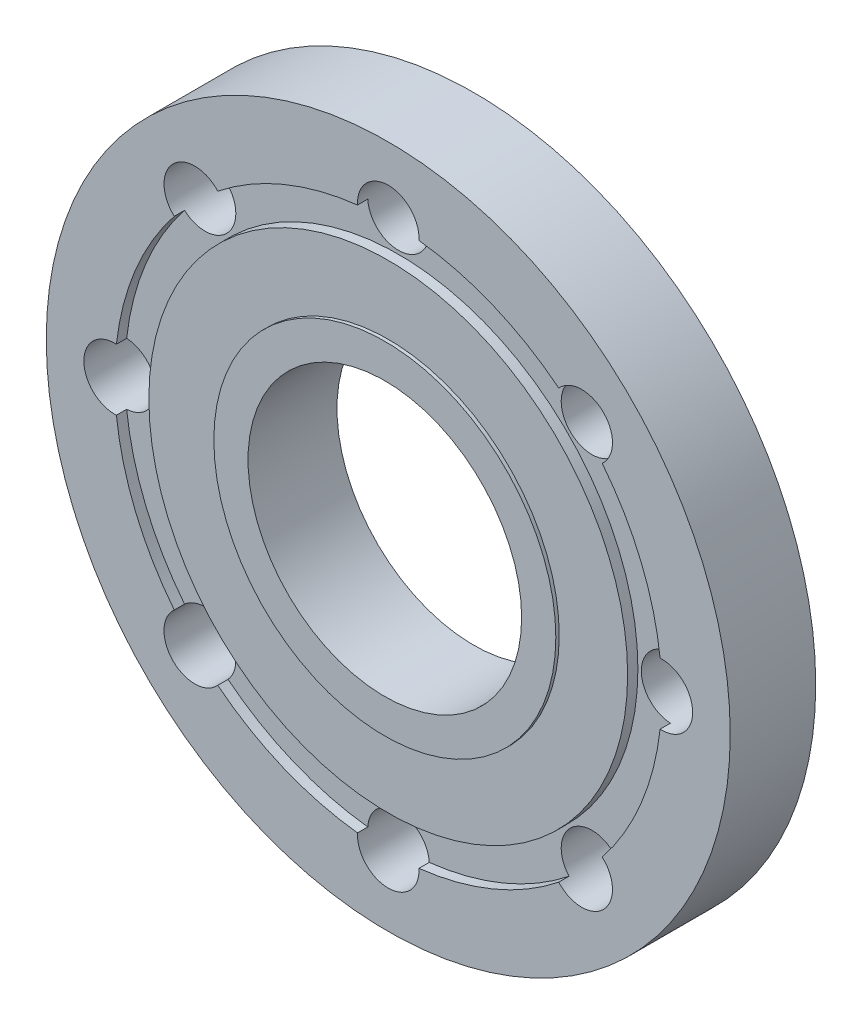
ISO-10303-21;
HEADER;
FILE_DESCRIPTION(('STEP AP214'),'2;1');
FILE_NAME('part.step','',(''),(''),'','','');
FILE_SCHEMA(('AUTOMOTIVE_DESIGN { 1 0 10303 214 1 1 1 1 }'));
ENDSEC;
DATA;
#1=APPLICATION_CONTEXT('core data for automotive mechanical design processes');
#2=APPLICATION_PROTOCOL_DEFINITION('international standard','automotive_design',2000,#1);
#3=PRODUCT_CONTEXT('',#1,'mechanical');
#4=PRODUCT('Part','Part','',(#3));
#5=PRODUCT_RELATED_PRODUCT_CATEGORY('part','',(#4));
#6=PRODUCT_DEFINITION_FORMATION('','',#4);
#7=PRODUCT_DEFINITION_CONTEXT('part definition',#1,'design');
#8=PRODUCT_DEFINITION('design','',#6,#7);
#9=PRODUCT_DEFINITION_SHAPE('','',#8);
#10=(LENGTH_UNIT() NAMED_UNIT(*) SI_UNIT(.MILLI.,.METRE.));
#11=(NAMED_UNIT(*) PLANE_ANGLE_UNIT() SI_UNIT($,.RADIAN.));
#12=(NAMED_UNIT(*) SI_UNIT($,.STERADIAN.) SOLID_ANGLE_UNIT());
#13=UNCERTAINTY_MEASURE_WITH_UNIT(LENGTH_MEASURE(1.E-05),#10,'distance_accuracy_value','');
#14=(GEOMETRIC_REPRESENTATION_CONTEXT(3) GLOBAL_UNCERTAINTY_ASSIGNED_CONTEXT((#13)) GLOBAL_UNIT_ASSIGNED_CONTEXT((#10,
#11,#12)) REPRESENTATION_CONTEXT('',''));
#15=CARTESIAN_POINT('',(0.,0.,0.));
#16=DIRECTION('',(0.,0.,1.));
#17=DIRECTION('',(1.,0.,0.));
#18=AXIS2_PLACEMENT_3D('',#15,#16,#17);
#19=CARTESIAN_POINT('',(0.,0.,25.));
#20=DIRECTION('',(0.,0.,1.));
#21=DIRECTION('',(1.,0.,0.));
#22=AXIS2_PLACEMENT_3D('',#19,#20,#21);
#23=PLANE('',#22);
#24=CARTESIAN_POINT('',(0.,0.,25.));
#25=DIRECTION('',(0.,0.,1.));
#26=DIRECTION('',(1.,0.,0.));
#27=AXIS2_PLACEMENT_3D('',#24,#25,#26);
#28=CIRCLE('',#27,50.);
#29=CARTESIAN_POINT('',(50.,0.,25.));
#30=VERTEX_POINT('',#29);
#31=EDGE_CURVE('E25',#30,#30,#28,.T.);
#32=ORIENTED_EDGE('',*,*,#31,.F.);
#33=EDGE_LOOP('',(#32));
#34=FACE_BOUND('',#33,.T.);
#35=CARTESIAN_POINT('',(3.794298208959E-13,0.,25.));
#36=DIRECTION('',(0.,0.,1.));
#37=DIRECTION('',(1.,0.,0.));
#38=AXIS2_PLACEMENT_3D('',#35,#36,#37);
#39=CIRCLE('',#38,70.);
#40=CARTESIAN_POINT('',(70.,0.,25.));
#41=VERTEX_POINT('',#40);
#42=EDGE_CURVE('E501',#41,#41,#39,.T.);
#43=ORIENTED_EDGE('',*,*,#42,.T.);
#44=EDGE_LOOP('',(#43));
#45=FACE_BOUND('',#44,.T.);
#46=ADVANCED_FACE('F16',(#34,#45),#23,.T.);
#47=CARTESIAN_POINT('',(0.,0.,25.));
#48=DIRECTION('',(0.,0.,1.));
#49=DIRECTION('',(1.,0.,0.));
#50=AXIS2_PLACEMENT_3D('',#47,#48,#49);
#51=CYLINDRICAL_SURFACE('',#50,50.);
#52=ORIENTED_EDGE('',*,*,#31,.T.);
#53=DIRECTION('',(0.,0.,1.));
#54=VECTOR('',#53,1.);
#55=CARTESIAN_POINT('',(50.,0.,25.));
#56=LINE('',#55,#54);
#57=CARTESIAN_POINT('',(50.,0.,26.));
#58=VERTEX_POINT('',#57);
#59=EDGE_CURVE('E10',#30,#58,#56,.T.);
#60=ORIENTED_EDGE('',*,*,#59,.T.);
#61=CARTESIAN_POINT('',(0.,0.,26.));
#62=DIRECTION('',(0.,0.,1.));
#63=DIRECTION('',(1.,0.,0.));
#64=AXIS2_PLACEMENT_3D('',#61,#62,#63);
#65=CIRCLE('',#64,50.);
#66=EDGE_CURVE('E505',#58,#58,#65,.T.);
#67=ORIENTED_EDGE('',*,*,#66,.F.);
#68=ORIENTED_EDGE('',*,*,#59,.F.);
#69=EDGE_LOOP('',(#52,#60,#67,#68));
#70=FACE_BOUND('',#69,.T.);
#71=ADVANCED_FACE('F526',(#70),#51,.T.);
#72=CARTESIAN_POINT('',(3.794298208959E-13,0.,26.));
#73=DIRECTION('',(0.,0.,1.));
#74=DIRECTION('',(1.,0.,0.));
#75=AXIS2_PLACEMENT_3D('',#72,#73,#74);
#76=CYLINDRICAL_SURFACE('',#75,70.);
#77=ORIENTED_EDGE('',*,*,#42,.F.);
#78=DIRECTION('',(0.,0.,-1.));
#79=VECTOR('',#78,1.);
#80=CARTESIAN_POINT('',(70.,0.,26.));
#81=LINE('',#80,#79);
#82=CARTESIAN_POINT('',(70.,0.,22.));
#83=VERTEX_POINT('',#82);
#84=EDGE_CURVE('E192',#41,#83,#81,.T.);
#85=ORIENTED_EDGE('',*,*,#84,.T.);
#86=CARTESIAN_POINT('',(3.794298208959E-13,0.,22.));
#87=DIRECTION('',(0.,0.,1.));
#88=DIRECTION('',(1.,0.,0.));
#89=AXIS2_PLACEMENT_3D('',#86,#87,#88);
#90=CIRCLE('',#89,70.);
#91=EDGE_CURVE('E373',#83,#83,#90,.T.);
#92=ORIENTED_EDGE('',*,*,#91,.T.);
#93=ORIENTED_EDGE('',*,*,#84,.F.);
#94=EDGE_LOOP('',(#77,#85,#92,#93));
#95=FACE_BOUND('',#94,.T.);
#96=ADVANCED_FACE('F530',(#95),#76,.T.);
#97=CARTESIAN_POINT('',(0.,0.,26.));
#98=DIRECTION('',(0.,0.,1.));
#99=DIRECTION('',(1.,0.,0.));
#100=AXIS2_PLACEMENT_3D('',#97,#98,#99);
#101=CYLINDRICAL_SURFACE('',#100,80.);
#102=DIRECTION('',(0.,0.,1.));
#103=VECTOR('',#102,1.);
#104=CARTESIAN_POINT('',(-49.85668461805,62.564454755845,26.));
#105=LINE('',#104,#103);
#106=CARTESIAN_POINT('',(-49.85668461805,62.564454755845,22.));
#107=VERTEX_POINT('',#106);
#108=CARTESIAN_POINT('',(-49.85668461805,62.564454755845,25.));
#109=VERTEX_POINT('',#108);
#110=EDGE_CURVE('E484',#107,#109,#105,.T.);
#111=ORIENTED_EDGE('',*,*,#110,.F.);
#112=CARTESIAN_POINT('',(0.,0.,22.));
#113=DIRECTION('',(0.,0.,1.));
#114=DIRECTION('',(1.,0.,0.));
#115=AXIS2_PLACEMENT_3D('',#112,#113,#114);
#116=CIRCLE('',#115,80.);
#117=CARTESIAN_POINT('',(-8.985750438194,79.49375,22.));
#118=VERTEX_POINT('',#117);
#119=EDGE_CURVE('E328',#118,#107,#116,.T.);
#120=ORIENTED_EDGE('',*,*,#119,.F.);
#121=DIRECTION('',(0.,0.,1.));
#122=VECTOR('',#121,1.);
#123=CARTESIAN_POINT('',(-8.985750438194,79.49375,26.));
#124=LINE('',#123,#122);
#125=CARTESIAN_POINT('',(-8.985750438194,79.49375,25.));
#126=VERTEX_POINT('',#125);
#127=EDGE_CURVE('E357',#118,#126,#124,.T.);
#128=ORIENTED_EDGE('',*,*,#127,.T.);
#129=CARTESIAN_POINT('',(0.,0.,25.));
#130=DIRECTION('',(0.,0.,1.));
#131=DIRECTION('',(1.,0.,0.));
#132=AXIS2_PLACEMENT_3D('',#129,#130,#131);
#133=CIRCLE('',#132,80.);
#134=EDGE_CURVE('E184',#126,#109,#133,.T.);
#135=ORIENTED_EDGE('',*,*,#134,.T.);
#136=EDGE_LOOP('',(#111,#120,#128,#135));
#137=FACE_BOUND('',#136,.T.);
#138=ADVANCED_FACE('F566',(#137),#101,.F.);
#139=CARTESIAN_POINT('',(0.,0.,26.));
#140=DIRECTION('',(0.,0.,1.));
#141=DIRECTION('',(1.,0.,0.));
#142=AXIS2_PLACEMENT_3D('',#139,#140,#141);
#143=CYLINDRICAL_SURFACE('',#142,80.);
#144=DIRECTION('',(0.,0.,1.));
#145=VECTOR('',#144,1.);
#146=CARTESIAN_POINT('',(-79.49375,8.985750438194,26.));
#147=LINE('',#146,#145);
#148=CARTESIAN_POINT('',(-79.49375,8.985750438194,22.));
#149=VERTEX_POINT('',#148);
#150=CARTESIAN_POINT('',(-79.49375,8.985750438194,25.));
#151=VERTEX_POINT('',#150);
#152=EDGE_CURVE('E452',#149,#151,#147,.T.);
#153=ORIENTED_EDGE('',*,*,#152,.F.);
#154=CARTESIAN_POINT('',(0.,0.,22.));
#155=DIRECTION('',(0.,0.,1.));
#156=DIRECTION('',(1.,0.,0.));
#157=AXIS2_PLACEMENT_3D('',#154,#155,#156);
#158=CIRCLE('',#157,80.);
#159=CARTESIAN_POINT('',(-62.56445475584,49.856684618051,22.));
#160=VERTEX_POINT('',#159);
#161=EDGE_CURVE('E324',#160,#149,#158,.T.);
#162=ORIENTED_EDGE('',*,*,#161,.F.);
#163=DIRECTION('',(0.,0.,1.));
#164=VECTOR('',#163,1.);
#165=CARTESIAN_POINT('',(-62.56445475584,49.856684618051,26.));
#166=LINE('',#165,#164);
#167=CARTESIAN_POINT('',(-62.56445475584,49.856684618051,25.));
#168=VERTEX_POINT('',#167);
#169=EDGE_CURVE('E439',#160,#168,#166,.T.);
#170=ORIENTED_EDGE('',*,*,#169,.T.);
#171=CARTESIAN_POINT('',(0.,0.,25.));
#172=DIRECTION('',(0.,0.,1.));
#173=DIRECTION('',(1.,0.,0.));
#174=AXIS2_PLACEMENT_3D('',#171,#172,#173);
#175=CIRCLE('',#174,80.);
#176=EDGE_CURVE('E319',#168,#151,#175,.T.);
#177=ORIENTED_EDGE('',*,*,#176,.T.);
#178=EDGE_LOOP('',(#153,#162,#170,#177));
#179=FACE_BOUND('',#178,.T.);
#180=ADVANCED_FACE('F577',(#179),#143,.F.);
#181=CARTESIAN_POINT('',(0.,0.,26.));
#182=DIRECTION('',(0.,0.,1.));
#183=DIRECTION('',(1.,0.,0.));
#184=AXIS2_PLACEMENT_3D('',#181,#182,#183);
#185=PLANE('',#184);
#186=CARTESIAN_POINT('',(0.,0.,26.));
#187=DIRECTION('',(0.,0.,-1.));
#188=DIRECTION('',(1.,0.,0.));
#189=AXIS2_PLACEMENT_3D('',#186,#187,#188);
#190=CIRCLE('',#189,40.);
#191=CARTESIAN_POINT('',(40.,0.,26.));
#192=VERTEX_POINT('',#191);
#193=EDGE_CURVE('E434',#192,#192,#190,.T.);
#194=ORIENTED_EDGE('',*,*,#193,.T.);
#195=EDGE_LOOP('',(#194));
#196=FACE_BOUND('',#195,.T.);
#197=ORIENTED_EDGE('',*,*,#66,.T.);
#198=EDGE_LOOP('',(#197));
#199=FACE_BOUND('',#198,.T.);
#200=ADVANCED_FACE('F678',(#196,#199),#185,.T.);
#201=CARTESIAN_POINT('',(0.,0.,26.));
#202=DIRECTION('',(0.,0.,1.));
#203=DIRECTION('',(1.,0.,0.));
#204=AXIS2_PLACEMENT_3D('',#201,#202,#203);
#205=CYLINDRICAL_SURFACE('',#204,80.);
#206=DIRECTION('',(0.,0.,1.));
#207=VECTOR('',#206,1.);
#208=CARTESIAN_POINT('',(8.985750438194,79.49375,26.));
#209=LINE('',#208,#207);
#210=CARTESIAN_POINT('',(8.985750438194,79.49375,22.));
#211=VERTEX_POINT('',#210);
#212=CARTESIAN_POINT('',(8.985750438194,79.49375,25.));
#213=VERTEX_POINT('',#212);
#214=EDGE_CURVE('E469',#211,#213,#209,.T.);
#215=ORIENTED_EDGE('',*,*,#214,.F.);
#216=CARTESIAN_POINT('',(0.,0.,22.));
#217=DIRECTION('',(0.,0.,1.));
#218=DIRECTION('',(1.,0.,0.));
#219=AXIS2_PLACEMENT_3D('',#216,#217,#218);
#220=CIRCLE('',#219,80.);
#221=CARTESIAN_POINT('',(49.856684618051,62.564454755845,22.));
#222=VERTEX_POINT('',#221);
#223=EDGE_CURVE('E396',#222,#211,#220,.T.);
#224=ORIENTED_EDGE('',*,*,#223,.F.);
#225=DIRECTION('',(0.,0.,1.));
#226=VECTOR('',#225,1.);
#227=CARTESIAN_POINT('',(49.856684618051,62.564454755845,26.));
#228=LINE('',#227,#226);
#229=CARTESIAN_POINT('',(49.856684618051,62.564454755845,25.));
#230=VERTEX_POINT('',#229);
#231=EDGE_CURVE('E391',#222,#230,#228,.T.);
#232=ORIENTED_EDGE('',*,*,#231,.T.);
#233=CARTESIAN_POINT('',(0.,0.,25.));
#234=DIRECTION('',(0.,0.,1.));
#235=DIRECTION('',(1.,0.,0.));
#236=AXIS2_PLACEMENT_3D('',#233,#234,#235);
#237=CIRCLE('',#236,80.);
#238=EDGE_CURVE('E318',#230,#213,#237,.T.);
#239=ORIENTED_EDGE('',*,*,#238,.T.);
#240=EDGE_LOOP('',(#215,#224,#232,#239));
#241=FACE_BOUND('',#240,.T.);
#242=ADVANCED_FACE('F561',(#241),#205,.F.);
#243=CARTESIAN_POINT('',(0.,0.,26.));
#244=DIRECTION('',(0.,0.,1.));
#245=DIRECTION('',(1.,0.,0.));
#246=AXIS2_PLACEMENT_3D('',#243,#244,#245);
#247=CYLINDRICAL_SURFACE('',#246,80.);
#248=DIRECTION('',(0.,0.,1.));
#249=VECTOR('',#248,1.);
#250=CARTESIAN_POINT('',(62.564454755845,49.856684618051,26.));
#251=LINE('',#250,#249);
#252=CARTESIAN_POINT('',(62.564454755845,49.856684618051,22.));
#253=VERTEX_POINT('',#252);
#254=CARTESIAN_POINT('',(62.564454755845,49.856684618051,25.));
#255=VERTEX_POINT('',#254);
#256=EDGE_CURVE('E425',#253,#255,#251,.T.);
#257=ORIENTED_EDGE('',*,*,#256,.F.);
#258=CARTESIAN_POINT('',(0.,0.,22.));
#259=DIRECTION('',(0.,0.,1.));
#260=DIRECTION('',(1.,0.,0.));
#261=AXIS2_PLACEMENT_3D('',#258,#259,#260);
#262=CIRCLE('',#261,80.);
#263=CARTESIAN_POINT('',(79.49375,8.985750438194,22.));
#264=VERTEX_POINT('',#263);
#265=EDGE_CURVE('E399',#264,#253,#262,.T.);
#266=ORIENTED_EDGE('',*,*,#265,.F.);
#267=DIRECTION('',(0.,0.,1.));
#268=VECTOR('',#267,1.);
#269=CARTESIAN_POINT('',(79.49375,8.985750438194,26.));
#270=LINE('',#269,#268);
#271=CARTESIAN_POINT('',(79.49375,8.985750438194,25.));
#272=VERTEX_POINT('',#271);
#273=EDGE_CURVE('E407',#264,#272,#270,.T.);
#274=ORIENTED_EDGE('',*,*,#273,.T.);
#275=CARTESIAN_POINT('',(0.,0.,25.));
#276=DIRECTION('',(0.,0.,1.));
#277=DIRECTION('',(1.,0.,0.));
#278=AXIS2_PLACEMENT_3D('',#275,#276,#277);
#279=CIRCLE('',#278,80.);
#280=EDGE_CURVE('E489',#272,#255,#279,.T.);
#281=ORIENTED_EDGE('',*,*,#280,.T.);
#282=EDGE_LOOP('',(#257,#266,#274,#281));
#283=FACE_BOUND('',#282,.T.);
#284=ADVANCED_FACE('F549',(#283),#247,.F.);
#285=CARTESIAN_POINT('',(0.,0.,26.));
#286=DIRECTION('',(0.,0.,1.));
#287=DIRECTION('',(1.,0.,0.));
#288=AXIS2_PLACEMENT_3D('',#285,#286,#287);
#289=CYLINDRICAL_SURFACE('',#288,80.);
#290=CARTESIAN_POINT('',(0.,0.,22.));
#291=DIRECTION('',(0.,0.,1.));
#292=DIRECTION('',(1.,0.,0.));
#293=AXIS2_PLACEMENT_3D('',#290,#291,#292);
#294=CIRCLE('',#293,80.);
#295=CARTESIAN_POINT('',(-79.49375,-8.985750438194,22.));
#296=VERTEX_POINT('',#295);
#297=CARTESIAN_POINT('',(-62.56445475584,-49.85668461805,22.));
#298=VERTEX_POINT('',#297);
#299=EDGE_CURVE('E327',#296,#298,#294,.T.);
#300=ORIENTED_EDGE('',*,*,#299,.F.);
#301=DIRECTION('',(0.,0.,1.));
#302=VECTOR('',#301,1.);
#303=CARTESIAN_POINT('',(-79.49375,-8.985750438194,26.));
#304=LINE('',#303,#302);
#305=CARTESIAN_POINT('',(-79.49375,-8.985750438194,25.));
#306=VERTEX_POINT('',#305);
#307=EDGE_CURVE('E451',#296,#306,#304,.T.);
#308=ORIENTED_EDGE('',*,*,#307,.T.);
#309=CARTESIAN_POINT('',(0.,0.,25.));
#310=DIRECTION('',(0.,0.,1.));
#311=DIRECTION('',(1.,0.,0.));
#312=AXIS2_PLACEMENT_3D('',#309,#310,#311);
#313=CIRCLE('',#312,80.);
#314=CARTESIAN_POINT('',(-62.56445475584,-49.85668461805,25.));
#315=VERTEX_POINT('',#314);
#316=EDGE_CURVE('E459',#306,#315,#313,.T.);
#317=ORIENTED_EDGE('',*,*,#316,.T.);
#318=DIRECTION('',(0.,0.,1.));
#319=VECTOR('',#318,1.);
#320=CARTESIAN_POINT('',(-62.56445475584,-49.85668461805,26.));
#321=LINE('',#320,#319);
#322=EDGE_CURVE('E382',#298,#315,#321,.T.);
#323=ORIENTED_EDGE('',*,*,#322,.F.);
#324=EDGE_LOOP('',(#300,#308,#317,#323));
#325=FACE_BOUND('',#324,.T.);
#326=ADVANCED_FACE('F640',(#325),#289,.F.);
#327=CARTESIAN_POINT('',(0.,0.,26.));
#328=DIRECTION('',(0.,0.,1.));
#329=DIRECTION('',(1.,0.,0.));
#330=AXIS2_PLACEMENT_3D('',#327,#328,#329);
#331=CYLINDRICAL_SURFACE('',#330,80.);
#332=CARTESIAN_POINT('',(0.,0.,22.));
#333=DIRECTION('',(0.,0.,1.));
#334=DIRECTION('',(1.,0.,0.));
#335=AXIS2_PLACEMENT_3D('',#332,#333,#334);
#336=CIRCLE('',#335,80.);
#337=CARTESIAN_POINT('',(-49.85668461805,-62.56445475584,22.));
#338=VERTEX_POINT('',#337);
#339=CARTESIAN_POINT('',(-8.985750438194,-79.49375,22.));
#340=VERTEX_POINT('',#339);
#341=EDGE_CURVE('E374',#338,#340,#336,.T.);
#342=ORIENTED_EDGE('',*,*,#341,.F.);
#343=DIRECTION('',(0.,0.,1.));
#344=VECTOR('',#343,1.);
#345=CARTESIAN_POINT('',(-49.85668461805,-62.56445475584,26.));
#346=LINE('',#345,#344);
#347=CARTESIAN_POINT('',(-49.85668461805,-62.56445475584,25.));
#348=VERTEX_POINT('',#347);
#349=EDGE_CURVE('E369',#338,#348,#346,.T.);
#350=ORIENTED_EDGE('',*,*,#349,.T.);
#351=CARTESIAN_POINT('',(0.,0.,25.));
#352=DIRECTION('',(0.,0.,1.));
#353=DIRECTION('',(1.,0.,0.));
#354=AXIS2_PLACEMENT_3D('',#351,#352,#353);
#355=CIRCLE('',#354,80.);
#356=CARTESIAN_POINT('',(-8.985750438194,-79.49375,25.));
#357=VERTEX_POINT('',#356);
#358=EDGE_CURVE('E498',#348,#357,#355,.T.);
#359=ORIENTED_EDGE('',*,*,#358,.T.);
#360=DIRECTION('',(0.,0.,1.));
#361=VECTOR('',#360,1.);
#362=CARTESIAN_POINT('',(-8.985750438194,-79.49375,26.));
#363=LINE('',#362,#361);
#364=EDGE_CURVE('E346',#340,#357,#363,.T.);
#365=ORIENTED_EDGE('',*,*,#364,.F.);
#366=EDGE_LOOP('',(#342,#350,#359,#365));
#367=FACE_BOUND('',#366,.T.);
#368=ADVANCED_FACE('F637',(#367),#331,.F.);
#369=CARTESIAN_POINT('',(0.,0.,26.));
#370=DIRECTION('',(0.,0.,1.));
#371=DIRECTION('',(1.,0.,0.));
#372=AXIS2_PLACEMENT_3D('',#369,#370,#371);
#373=CYLINDRICAL_SURFACE('',#372,80.);
#374=CARTESIAN_POINT('',(0.,0.,22.));
#375=DIRECTION('',(0.,0.,1.));
#376=DIRECTION('',(1.,0.,0.));
#377=AXIS2_PLACEMENT_3D('',#374,#375,#376);
#378=CIRCLE('',#377,80.);
#379=CARTESIAN_POINT('',(62.564454755845,-49.85668461805,22.));
#380=VERTEX_POINT('',#379);
#381=CARTESIAN_POINT('',(79.49375,-8.985750438194,22.));
#382=VERTEX_POINT('',#381);
#383=EDGE_CURVE('E370',#380,#382,#378,.T.);
#384=ORIENTED_EDGE('',*,*,#383,.F.);
#385=DIRECTION('',(0.,0.,1.));
#386=VECTOR('',#385,1.);
#387=CARTESIAN_POINT('',(62.564454755845,-49.85668461805,26.));
#388=LINE('',#387,#386);
#389=CARTESIAN_POINT('',(62.564454755845,-49.85668461805,25.));
#390=VERTEX_POINT('',#389);
#391=EDGE_CURVE('E293',#380,#390,#388,.T.);
#392=ORIENTED_EDGE('',*,*,#391,.T.);
#393=CARTESIAN_POINT('',(0.,0.,25.));
#394=DIRECTION('',(0.,0.,1.));
#395=DIRECTION('',(1.,0.,0.));
#396=AXIS2_PLACEMENT_3D('',#393,#394,#395);
#397=CIRCLE('',#396,80.);
#398=CARTESIAN_POINT('',(79.49375,-8.985750438194,25.));
#399=VERTEX_POINT('',#398);
#400=EDGE_CURVE('E492',#390,#399,#397,.T.);
#401=ORIENTED_EDGE('',*,*,#400,.T.);
#402=DIRECTION('',(0.,0.,1.));
#403=VECTOR('',#402,1.);
#404=CARTESIAN_POINT('',(79.49375,-8.985750438194,26.));
#405=LINE('',#404,#403);
#406=EDGE_CURVE('E307',#382,#399,#405,.T.);
#407=ORIENTED_EDGE('',*,*,#406,.F.);
#408=EDGE_LOOP('',(#384,#392,#401,#407));
#409=FACE_BOUND('',#408,.T.);
#410=ADVANCED_FACE('F537',(#409),#373,.F.);
#411=CARTESIAN_POINT('',(0.,0.,22.));
#412=DIRECTION('',(0.,0.,1.));
#413=DIRECTION('',(1.,0.,0.));
#414=AXIS2_PLACEMENT_3D('',#411,#412,#413);
#415=PLANE('',#414);
#416=ORIENTED_EDGE('',*,*,#91,.F.);
#417=EDGE_LOOP('',(#416));
#418=FACE_BOUND('',#417,.T.);
#419=CARTESIAN_POINT('',(80.,0.,22.));
#420=DIRECTION('',(0.,0.,-1.));
#421=DIRECTION('',(1.,0.,0.));
#422=AXIS2_PLACEMENT_3D('',#419,#420,#421);
#423=CIRCLE('',#422,9.);
#424=EDGE_CURVE('E411',#382,#264,#423,.T.);
#425=ORIENTED_EDGE('',*,*,#424,.T.);
#426=ORIENTED_EDGE('',*,*,#265,.T.);
#427=CARTESIAN_POINT('',(56.568542494924,56.568542494924,22.));
#428=DIRECTION('',(0.,0.,-1.));
#429=DIRECTION('',(0.707106781186548,0.707106781186548,0.));
#430=AXIS2_PLACEMENT_3D('',#427,#428,#429);
#431=CIRCLE('',#430,9.);
#432=EDGE_CURVE('E421',#253,#222,#431,.T.);
#433=ORIENTED_EDGE('',*,*,#432,.T.);
#434=ORIENTED_EDGE('',*,*,#223,.T.);
#435=CARTESIAN_POINT('',(0.,80.,22.));
#436=DIRECTION('',(0.,0.,-1.));
#437=DIRECTION('',(0.,1.,0.));
#438=AXIS2_PLACEMENT_3D('',#435,#436,#437);
#439=CIRCLE('',#438,9.);
#440=EDGE_CURVE('E465',#211,#118,#439,.T.);
#441=ORIENTED_EDGE('',*,*,#440,.T.);
#442=ORIENTED_EDGE('',*,*,#119,.T.);
#443=CARTESIAN_POINT('',(-56.56854249492,56.568542494924,22.));
#444=DIRECTION('',(0.,0.,-1.));
#445=DIRECTION('',(-0.707106781186548,0.707106781186548,0.));
#446=AXIS2_PLACEMENT_3D('',#443,#444,#445);
#447=CIRCLE('',#446,9.);
#448=EDGE_CURVE('E480',#107,#160,#447,.T.);
#449=ORIENTED_EDGE('',*,*,#448,.T.);
#450=ORIENTED_EDGE('',*,*,#161,.T.);
#451=CARTESIAN_POINT('',(-80.,0.,22.));
#452=DIRECTION('',(0.,0.,-1.));
#453=DIRECTION('',(-1.,0.,0.));
#454=AXIS2_PLACEMENT_3D('',#451,#452,#453);
#455=CIRCLE('',#454,9.);
#456=EDGE_CURVE('E456',#149,#296,#455,.T.);
#457=ORIENTED_EDGE('',*,*,#456,.T.);
#458=ORIENTED_EDGE('',*,*,#299,.T.);
#459=CARTESIAN_POINT('',(-56.56854249492,-56.56854249492,22.));
#460=DIRECTION('',(0.,0.,-1.));
#461=DIRECTION('',(-0.707106781186548,-0.707106781186548,0.));
#462=AXIS2_PLACEMENT_3D('',#459,#460,#461);
#463=CIRCLE('',#462,9.);
#464=EDGE_CURVE('E378',#298,#338,#463,.T.);
#465=ORIENTED_EDGE('',*,*,#464,.T.);
#466=ORIENTED_EDGE('',*,*,#341,.T.);
#467=CARTESIAN_POINT('',(0.,-80.,22.));
#468=DIRECTION('',(0.,0.,-1.));
#469=DIRECTION('',(0.,-1.,0.));
#470=AXIS2_PLACEMENT_3D('',#467,#468,#469);
#471=CIRCLE('',#470,9.);
#472=CARTESIAN_POINT('',(8.985750438194,-79.49375,22.));
#473=VERTEX_POINT('',#472);
#474=EDGE_CURVE('E342',#340,#473,#471,.T.);
#475=ORIENTED_EDGE('',*,*,#474,.T.);
#476=CARTESIAN_POINT('',(0.,0.,22.));
#477=DIRECTION('',(0.,0.,1.));
#478=DIRECTION('',(1.,0.,0.));
#479=AXIS2_PLACEMENT_3D('',#476,#477,#478);
#480=CIRCLE('',#479,80.);
#481=CARTESIAN_POINT('',(49.856684618051,-62.56445475584,22.));
#482=VERTEX_POINT('',#481);
#483=EDGE_CURVE('E349',#473,#482,#480,.T.);
#484=ORIENTED_EDGE('',*,*,#483,.T.);
#485=CARTESIAN_POINT('',(56.568542494924,-56.56854249492,22.));
#486=DIRECTION('',(0.,0.,-1.));
#487=DIRECTION('',(0.707106781186548,-0.707106781186548,0.));
#488=AXIS2_PLACEMENT_3D('',#485,#486,#487);
#489=CIRCLE('',#488,9.);
#490=EDGE_CURVE('E297',#482,#380,#489,.T.);
#491=ORIENTED_EDGE('',*,*,#490,.T.);
#492=ORIENTED_EDGE('',*,*,#383,.T.);
#493=EDGE_LOOP('',(#425,#426,#433,#434,#441,#442,#449,#450,#457,#458,#465,#466,#475,#484,#491,#492));
#494=FACE_BOUND('',#493,.T.);
#495=ADVANCED_FACE('F533',(#418,#494),#415,.T.);
#496=CARTESIAN_POINT('',(0.,0.,26.));
#497=DIRECTION('',(0.,0.,1.));
#498=DIRECTION('',(1.,0.,0.));
#499=AXIS2_PLACEMENT_3D('',#496,#497,#498);
#500=CYLINDRICAL_SURFACE('',#499,80.);
#501=ORIENTED_EDGE('',*,*,#483,.F.);
#502=DIRECTION('',(0.,0.,1.));
#503=VECTOR('',#502,1.);
#504=CARTESIAN_POINT('',(8.985750438194,-79.49375,26.));
#505=LINE('',#504,#503);
#506=CARTESIAN_POINT('',(8.985750438194,-79.49375,25.));
#507=VERTEX_POINT('',#506);
#508=EDGE_CURVE('E338',#473,#507,#505,.T.);
#509=ORIENTED_EDGE('',*,*,#508,.T.);
#510=CARTESIAN_POINT('',(0.,0.,25.));
#511=DIRECTION('',(0.,0.,1.));
#512=DIRECTION('',(1.,0.,0.));
#513=AXIS2_PLACEMENT_3D('',#510,#511,#512);
#514=CIRCLE('',#513,80.);
#515=CARTESIAN_POINT('',(49.856684618051,-62.56445475584,25.));
#516=VERTEX_POINT('',#515);
#517=EDGE_CURVE('E495',#507,#516,#514,.T.);
#518=ORIENTED_EDGE('',*,*,#517,.T.);
#519=DIRECTION('',(0.,0.,1.));
#520=VECTOR('',#519,1.);
#521=CARTESIAN_POINT('',(49.856684618051,-62.56445475584,26.));
#522=LINE('',#521,#520);
#523=EDGE_CURVE('E301',#482,#516,#522,.T.);
#524=ORIENTED_EDGE('',*,*,#523,.F.);
#525=EDGE_LOOP('',(#501,#509,#518,#524));
#526=FACE_BOUND('',#525,.T.);
#527=ADVANCED_FACE('F536',(#526),#500,.F.);
#528=CARTESIAN_POINT('',(0.,0.,25.));
#529=DIRECTION('',(0.,0.,1.));
#530=DIRECTION('',(1.,0.,0.));
#531=AXIS2_PLACEMENT_3D('',#528,#529,#530);
#532=PLANE('',#531);
#533=ORIENTED_EDGE('',*,*,#280,.F.);
#534=CARTESIAN_POINT('',(80.,0.,25.));
#535=DIRECTION('',(0.,0.,-1.));
#536=DIRECTION('',(1.,0.,0.));
#537=AXIS2_PLACEMENT_3D('',#534,#535,#536);
#538=CIRCLE('',#537,9.);
#539=CARTESIAN_POINT('',(89.,0.,25.));
#540=VERTEX_POINT('',#539);
#541=EDGE_CURVE('E403',#272,#540,#538,.T.);
#542=ORIENTED_EDGE('',*,*,#541,.T.);
#543=CARTESIAN_POINT('',(80.,0.,25.));
#544=DIRECTION('',(0.,0.,-1.));
#545=DIRECTION('',(1.,0.,0.));
#546=AXIS2_PLACEMENT_3D('',#543,#544,#545);
#547=CIRCLE('',#546,9.);
#548=EDGE_CURVE('E302',#540,#399,#547,.T.);
#549=ORIENTED_EDGE('',*,*,#548,.T.);
#550=ORIENTED_EDGE('',*,*,#400,.F.);
#551=CARTESIAN_POINT('',(56.568542494924,-56.56854249492,25.));
#552=DIRECTION('',(0.,0.,-1.));
#553=DIRECTION('',(0.707106781186548,-0.707106781186548,0.));
#554=AXIS2_PLACEMENT_3D('',#551,#552,#553);
#555=CIRCLE('',#554,9.);
#556=CARTESIAN_POINT('',(62.932503525603,-62.9325035256,25.));
#557=VERTEX_POINT('',#556);
#558=EDGE_CURVE('E289',#390,#557,#555,.T.);
#559=ORIENTED_EDGE('',*,*,#558,.T.);
#560=CARTESIAN_POINT('',(56.568542494924,-56.56854249492,25.));
#561=DIRECTION('',(0.,0.,-1.));
#562=DIRECTION('',(0.707106781186548,-0.707106781186548,0.));
#563=AXIS2_PLACEMENT_3D('',#560,#561,#562);
#564=CIRCLE('',#563,9.);
#565=EDGE_CURVE('E311',#557,#516,#564,.T.);
#566=ORIENTED_EDGE('',*,*,#565,.T.);
#567=ORIENTED_EDGE('',*,*,#517,.F.);
#568=CARTESIAN_POINT('',(0.,-80.,25.));
#569=DIRECTION('',(0.,0.,-1.));
#570=DIRECTION('',(0.,-1.,0.));
#571=AXIS2_PLACEMENT_3D('',#568,#569,#570);
#572=CIRCLE('',#571,9.);
#573=CARTESIAN_POINT('',(0.,-89.,25.));
#574=VERTEX_POINT('',#573);
#575=EDGE_CURVE('E323',#507,#574,#572,.T.);
#576=ORIENTED_EDGE('',*,*,#575,.T.);
#577=CARTESIAN_POINT('',(0.,-80.,25.));
#578=DIRECTION('',(0.,0.,-1.));
#579=DIRECTION('',(0.,-1.,0.));
#580=AXIS2_PLACEMENT_3D('',#577,#578,#579);
#581=CIRCLE('',#580,9.);
#582=EDGE_CURVE('E353',#574,#357,#581,.T.);
#583=ORIENTED_EDGE('',*,*,#582,.T.);
#584=ORIENTED_EDGE('',*,*,#358,.F.);
#585=CARTESIAN_POINT('',(-56.56854249492,-56.56854249492,25.));
#586=DIRECTION('',(0.,0.,-1.));
#587=DIRECTION('',(-0.707106781186548,-0.707106781186548,0.));
#588=AXIS2_PLACEMENT_3D('',#585,#586,#587);
#589=CIRCLE('',#588,9.);
#590=CARTESIAN_POINT('',(-62.9325035256,-62.9325035256,25.));
#591=VERTEX_POINT('',#590);
#592=EDGE_CURVE('E365',#348,#591,#589,.T.);
#593=ORIENTED_EDGE('',*,*,#592,.T.);
#594=CARTESIAN_POINT('',(-56.56854249492,-56.56854249492,25.));
#595=DIRECTION('',(0.,0.,-1.));
#596=DIRECTION('',(-0.707106781186548,-0.707106781186548,0.));
#597=AXIS2_PLACEMENT_3D('',#594,#595,#596);
#598=CIRCLE('',#597,9.);
#599=EDGE_CURVE('E386',#591,#315,#598,.T.);
#600=ORIENTED_EDGE('',*,*,#599,.T.);
#601=ORIENTED_EDGE('',*,*,#316,.F.);
#602=CARTESIAN_POINT('',(-80.,0.,25.));
#603=DIRECTION('',(0.,0.,-1.));
#604=DIRECTION('',(-1.,0.,0.));
#605=AXIS2_PLACEMENT_3D('',#602,#603,#604);
#606=CIRCLE('',#605,9.);
#607=CARTESIAN_POINT('',(-89.,0.,25.));
#608=VERTEX_POINT('',#607);
#609=EDGE_CURVE('E447',#306,#608,#606,.T.);
#610=ORIENTED_EDGE('',*,*,#609,.T.);
#611=CARTESIAN_POINT('',(-80.,0.,25.));
#612=DIRECTION('',(0.,0.,-1.));
#613=DIRECTION('',(-1.,0.,0.));
#614=AXIS2_PLACEMENT_3D('',#611,#612,#613);
#615=CIRCLE('',#614,9.);
#616=EDGE_CURVE('E334',#608,#151,#615,.T.);
#617=ORIENTED_EDGE('',*,*,#616,.T.);
#618=ORIENTED_EDGE('',*,*,#176,.F.);
#619=CARTESIAN_POINT('',(-56.56854249492,56.568542494924,25.));
#620=DIRECTION('',(0.,0.,-1.));
#621=DIRECTION('',(-0.707106781186548,0.707106781186548,0.));
#622=AXIS2_PLACEMENT_3D('',#619,#620,#621);
#623=CIRCLE('',#622,9.);
#624=CARTESIAN_POINT('',(-62.9325035256,62.932503525603,25.));
#625=VERTEX_POINT('',#624);
#626=EDGE_CURVE('E435',#168,#625,#623,.T.);
#627=ORIENTED_EDGE('',*,*,#626,.T.);
#628=CARTESIAN_POINT('',(-56.56854249492,56.568542494924,25.));
#629=DIRECTION('',(0.,0.,-1.));
#630=DIRECTION('',(-0.707106781186548,0.707106781186548,0.));
#631=AXIS2_PLACEMENT_3D('',#628,#629,#630);
#632=CIRCLE('',#631,9.);
#633=EDGE_CURVE('E488',#625,#109,#632,.T.);
#634=ORIENTED_EDGE('',*,*,#633,.T.);
#635=ORIENTED_EDGE('',*,*,#134,.F.);
#636=CARTESIAN_POINT('',(0.,80.,25.));
#637=DIRECTION('',(0.,0.,-1.));
#638=DIRECTION('',(0.,1.,0.));
#639=AXIS2_PLACEMENT_3D('',#636,#637,#638);
#640=CIRCLE('',#639,9.);
#641=CARTESIAN_POINT('',(0.,89.,25.));
#642=VERTEX_POINT('',#641);
#643=EDGE_CURVE('E333',#126,#642,#640,.T.);
#644=ORIENTED_EDGE('',*,*,#643,.T.);
#645=CARTESIAN_POINT('',(0.,80.,25.));
#646=DIRECTION('',(0.,0.,-1.));
#647=DIRECTION('',(0.,1.,0.));
#648=AXIS2_PLACEMENT_3D('',#645,#646,#647);
#649=CIRCLE('',#648,9.);
#650=EDGE_CURVE('E473',#642,#213,#649,.T.);
#651=ORIENTED_EDGE('',*,*,#650,.T.);
#652=ORIENTED_EDGE('',*,*,#238,.F.);
#653=CARTESIAN_POINT('',(56.568542494924,56.568542494924,25.));
#654=DIRECTION('',(0.,0.,-1.));
#655=DIRECTION('',(0.707106781186548,0.707106781186548,0.));
#656=AXIS2_PLACEMENT_3D('',#653,#654,#655);
#657=CIRCLE('',#656,9.);
#658=CARTESIAN_POINT('',(62.932503525603,62.932503525603,25.));
#659=VERTEX_POINT('',#658);
#660=EDGE_CURVE('E387',#230,#659,#657,.T.);
#661=ORIENTED_EDGE('',*,*,#660,.T.);
#662=CARTESIAN_POINT('',(56.568542494924,56.568542494924,25.));
#663=DIRECTION('',(0.,0.,-1.));
#664=DIRECTION('',(0.707106781186548,0.707106781186548,0.));
#665=AXIS2_PLACEMENT_3D('',#662,#663,#664);
#666=CIRCLE('',#665,9.);
#667=EDGE_CURVE('E429',#659,#255,#666,.T.);
#668=ORIENTED_EDGE('',*,*,#667,.T.);
#669=EDGE_LOOP('',(#533,#542,#549,#550,#559,#566,#567,#576,#583,#584,#593,#600,#601,#610,#617,
#618,#627,#634,#635,#644,#651,#652,#661,#668));
#670=FACE_BOUND('',#669,.T.);
#671=CARTESIAN_POINT('',(0.,0.,25.));
#672=DIRECTION('',(0.,0.,1.));
#673=DIRECTION('',(1.,0.,0.));
#674=AXIS2_PLACEMENT_3D('',#671,#672,#673);
#675=CIRCLE('',#674,100.);
#676=CARTESIAN_POINT('',(100.,0.,25.));
#677=VERTEX_POINT('',#676);
#678=EDGE_CURVE('E273',#677,#677,#675,.T.);
#679=ORIENTED_EDGE('',*,*,#678,.T.);
#680=EDGE_LOOP('',(#679));
#681=FACE_BOUND('',#680,.T.);
#682=ADVANCED_FACE('F621',(#670,#681),#532,.T.);
#683=CARTESIAN_POINT('',(-56.56854249492,56.568542494924,0.));
#684=DIRECTION('',(0.,0.,-1.));
#685=DIRECTION('',(-0.707106781186548,0.707106781186548,0.));
#686=AXIS2_PLACEMENT_3D('',#683,#684,#685);
#687=CYLINDRICAL_SURFACE('',#686,9.);
#688=CARTESIAN_POINT('',(-56.56854249492,56.568542494924,0.));
#689=DIRECTION('',(0.,0.,1.));
#690=DIRECTION('',(-0.707106781186548,0.707106781186548,0.));
#691=AXIS2_PLACEMENT_3D('',#688,#689,#690);
#692=CIRCLE('',#691,9.);
#693=CARTESIAN_POINT('',(-62.9325035256,62.932503525603,0.));
#694=VERTEX_POINT('',#693);
#695=EDGE_CURVE('E275',#694,#694,#692,.T.);
#696=ORIENTED_EDGE('',*,*,#695,.F.);
#697=DIRECTION('',(0.,0.,1.));
#698=VECTOR('',#697,1.);
#699=CARTESIAN_POINT('',(-62.9325035256,62.932503525603,0.));
#700=LINE('',#699,#698);
#701=EDGE_CURVE('E440',#694,#625,#700,.T.);
#702=ORIENTED_EDGE('',*,*,#701,.T.);
#703=ORIENTED_EDGE('',*,*,#626,.F.);
#704=ORIENTED_EDGE('',*,*,#169,.F.);
#705=ORIENTED_EDGE('',*,*,#448,.F.);
#706=ORIENTED_EDGE('',*,*,#110,.T.);
#707=ORIENTED_EDGE('',*,*,#633,.F.);
#708=ORIENTED_EDGE('',*,*,#701,.F.);
#709=EDGE_LOOP('',(#696,#702,#703,#704,#705,#706,#707,#708));
#710=FACE_BOUND('',#709,.T.);
#711=ADVANCED_FACE('F574',(#710),#687,.F.);
#712=CARTESIAN_POINT('',(0.,80.,0.));
#713=DIRECTION('',(0.,0.,-1.));
#714=DIRECTION('',(0.,1.,0.));
#715=AXIS2_PLACEMENT_3D('',#712,#713,#714);
#716=CYLINDRICAL_SURFACE('',#715,9.);
#717=CARTESIAN_POINT('',(0.,80.,0.));
#718=DIRECTION('',(0.,0.,1.));
#719=DIRECTION('',(0.,1.,0.));
#720=AXIS2_PLACEMENT_3D('',#717,#718,#719);
#721=CIRCLE('',#720,9.);
#722=CARTESIAN_POINT('',(0.,89.,0.));
#723=VERTEX_POINT('',#722);
#724=EDGE_CURVE('E285',#723,#723,#721,.T.);
#725=ORIENTED_EDGE('',*,*,#724,.F.);
#726=DIRECTION('',(0.,0.,1.));
#727=VECTOR('',#726,1.);
#728=CARTESIAN_POINT('',(0.,89.,0.));
#729=LINE('',#728,#727);
#730=EDGE_CURVE('E329',#723,#642,#729,.T.);
#731=ORIENTED_EDGE('',*,*,#730,.T.);
#732=ORIENTED_EDGE('',*,*,#643,.F.);
#733=ORIENTED_EDGE('',*,*,#127,.F.);
#734=ORIENTED_EDGE('',*,*,#440,.F.);
#735=ORIENTED_EDGE('',*,*,#214,.T.);
#736=ORIENTED_EDGE('',*,*,#650,.F.);
#737=ORIENTED_EDGE('',*,*,#730,.F.);
#738=EDGE_LOOP('',(#725,#731,#732,#733,#734,#735,#736,#737));
#739=FACE_BOUND('',#738,.T.);
#740=ADVANCED_FACE('F564',(#739),#716,.F.);
#741=CARTESIAN_POINT('',(-80.,0.,0.));
#742=DIRECTION('',(0.,0.,-1.));
#743=DIRECTION('',(-1.,0.,0.));
#744=AXIS2_PLACEMENT_3D('',#741,#742,#743);
#745=CYLINDRICAL_SURFACE('',#744,9.);
#746=CARTESIAN_POINT('',(-80.,0.,0.));
#747=DIRECTION('',(0.,0.,1.));
#748=DIRECTION('',(-1.,0.,0.));
#749=AXIS2_PLACEMENT_3D('',#746,#747,#748);
#750=CIRCLE('',#749,9.);
#751=CARTESIAN_POINT('',(-89.,0.,0.));
#752=VERTEX_POINT('',#751);
#753=EDGE_CURVE('E609',#752,#752,#750,.T.);
#754=ORIENTED_EDGE('',*,*,#753,.F.);
#755=DIRECTION('',(0.,0.,1.));
#756=VECTOR('',#755,1.);
#757=CARTESIAN_POINT('',(-89.,0.,0.));
#758=LINE('',#757,#756);
#759=EDGE_CURVE('E443',#752,#608,#758,.T.);
#760=ORIENTED_EDGE('',*,*,#759,.T.);
#761=ORIENTED_EDGE('',*,*,#609,.F.);
#762=ORIENTED_EDGE('',*,*,#307,.F.);
#763=ORIENTED_EDGE('',*,*,#456,.F.);
#764=ORIENTED_EDGE('',*,*,#152,.T.);
#765=ORIENTED_EDGE('',*,*,#616,.F.);
#766=ORIENTED_EDGE('',*,*,#759,.F.);
#767=EDGE_LOOP('',(#754,#760,#761,#762,#763,#764,#765,#766));
#768=FACE_BOUND('',#767,.T.);
#769=ADVANCED_FACE('F582',(#768),#745,.F.);
#770=CARTESIAN_POINT('',(0.,0.,0.));
#771=DIRECTION('',(0.,0.,-1.));
#772=DIRECTION('',(1.,0.,0.));
#773=AXIS2_PLACEMENT_3D('',#770,#771,#772);
#774=CYLINDRICAL_SURFACE('',#773,40.);
#775=CARTESIAN_POINT('',(0.,0.,0.));
#776=DIRECTION('',(0.,0.,1.));
#777=DIRECTION('',(1.,0.,0.));
#778=AXIS2_PLACEMENT_3D('',#775,#776,#777);
#779=CIRCLE('',#778,40.);
#780=CARTESIAN_POINT('',(40.,0.,0.));
#781=VERTEX_POINT('',#780);
#782=EDGE_CURVE('E607',#781,#781,#779,.T.);
#783=ORIENTED_EDGE('',*,*,#782,.F.);
#784=DIRECTION('',(0.,0.,1.));
#785=VECTOR('',#784,1.);
#786=CARTESIAN_POINT('',(40.,0.,0.));
#787=LINE('',#786,#785);
#788=EDGE_CURVE('E430',#781,#192,#787,.T.);
#789=ORIENTED_EDGE('',*,*,#788,.T.);
#790=ORIENTED_EDGE('',*,*,#193,.F.);
#791=ORIENTED_EDGE('',*,*,#788,.F.);
#792=EDGE_LOOP('',(#783,#789,#790,#791));
#793=FACE_BOUND('',#792,.T.);
#794=ADVANCED_FACE('F653',(#793),#774,.F.);
#795=CARTESIAN_POINT('',(56.568542494924,56.568542494924,0.));
#796=DIRECTION('',(0.,0.,-1.));
#797=DIRECTION('',(0.707106781186548,0.707106781186548,0.));
#798=AXIS2_PLACEMENT_3D('',#795,#796,#797);
#799=CYLINDRICAL_SURFACE('',#798,9.);
#800=CARTESIAN_POINT('',(56.568542494924,56.568542494924,0.));
#801=DIRECTION('',(0.,0.,1.));
#802=DIRECTION('',(0.707106781186548,0.707106781186548,0.));
#803=AXIS2_PLACEMENT_3D('',#800,#801,#802);
#804=CIRCLE('',#803,9.);
#805=CARTESIAN_POINT('',(62.932503525603,62.932503525603,0.));
#806=VERTEX_POINT('',#805);
#807=EDGE_CURVE('E604',#806,#806,#804,.T.);
#808=ORIENTED_EDGE('',*,*,#807,.F.);
#809=DIRECTION('',(0.,0.,1.));
#810=VECTOR('',#809,1.);
#811=CARTESIAN_POINT('',(62.932503525603,62.932503525603,0.));
#812=LINE('',#811,#810);
#813=EDGE_CURVE('E306',#806,#659,#812,.T.);
#814=ORIENTED_EDGE('',*,*,#813,.T.);
#815=ORIENTED_EDGE('',*,*,#660,.F.);
#816=ORIENTED_EDGE('',*,*,#231,.F.);
#817=ORIENTED_EDGE('',*,*,#432,.F.);
#818=ORIENTED_EDGE('',*,*,#256,.T.);
#819=ORIENTED_EDGE('',*,*,#667,.F.);
#820=ORIENTED_EDGE('',*,*,#813,.F.);
#821=EDGE_LOOP('',(#808,#814,#815,#816,#817,#818,#819,#820));
#822=FACE_BOUND('',#821,.T.);
#823=ADVANCED_FACE('F555',(#822),#799,.F.);
#824=CARTESIAN_POINT('',(80.,0.,0.));
#825=DIRECTION('',(0.,0.,-1.));
#826=DIRECTION('',(1.,0.,0.));
#827=AXIS2_PLACEMENT_3D('',#824,#825,#826);
#828=CYLINDRICAL_SURFACE('',#827,9.);
#829=CARTESIAN_POINT('',(80.,0.,0.));
#830=DIRECTION('',(0.,0.,1.));
#831=DIRECTION('',(1.,0.,0.));
#832=AXIS2_PLACEMENT_3D('',#829,#830,#831);
#833=CIRCLE('',#832,9.);
#834=CARTESIAN_POINT('',(89.,0.,0.));
#835=VERTEX_POINT('',#834);
#836=EDGE_CURVE('E600',#835,#835,#833,.T.);
#837=ORIENTED_EDGE('',*,*,#836,.F.);
#838=DIRECTION('',(0.,0.,1.));
#839=VECTOR('',#838,1.);
#840=CARTESIAN_POINT('',(89.,0.,0.));
#841=LINE('',#840,#839);
#842=EDGE_CURVE('E395',#835,#540,#841,.T.);
#843=ORIENTED_EDGE('',*,*,#842,.T.);
#844=ORIENTED_EDGE('',*,*,#541,.F.);
#845=ORIENTED_EDGE('',*,*,#273,.F.);
#846=ORIENTED_EDGE('',*,*,#424,.F.);
#847=ORIENTED_EDGE('',*,*,#406,.T.);
#848=ORIENTED_EDGE('',*,*,#548,.F.);
#849=ORIENTED_EDGE('',*,*,#842,.F.);
#850=EDGE_LOOP('',(#837,#843,#844,#845,#846,#847,#848,#849));
#851=FACE_BOUND('',#850,.T.);
#852=ADVANCED_FACE('F547',(#851),#828,.F.);
#853=CARTESIAN_POINT('',(-56.56854249492,-56.56854249492,0.));
#854=DIRECTION('',(0.,0.,-1.));
#855=DIRECTION('',(-0.707106781186548,-0.707106781186548,0.));
#856=AXIS2_PLACEMENT_3D('',#853,#854,#855);
#857=CYLINDRICAL_SURFACE('',#856,9.);
#858=CARTESIAN_POINT('',(-56.56854249492,-56.56854249492,0.));
#859=DIRECTION('',(0.,0.,1.));
#860=DIRECTION('',(-0.707106781186548,-0.707106781186548,0.));
#861=AXIS2_PLACEMENT_3D('',#858,#859,#860);
#862=CIRCLE('',#861,9.);
#863=CARTESIAN_POINT('',(-62.9325035256,-62.9325035256,0.));
#864=VERTEX_POINT('',#863);
#865=EDGE_CURVE('E598',#864,#864,#862,.T.);
#866=ORIENTED_EDGE('',*,*,#865,.F.);
#867=DIRECTION('',(0.,0.,1.));
#868=VECTOR('',#867,1.);
#869=CARTESIAN_POINT('',(-62.9325035256,-62.9325035256,0.));
#870=LINE('',#869,#868);
#871=EDGE_CURVE('E361',#864,#591,#870,.T.);
#872=ORIENTED_EDGE('',*,*,#871,.T.);
#873=ORIENTED_EDGE('',*,*,#592,.F.);
#874=ORIENTED_EDGE('',*,*,#349,.F.);
#875=ORIENTED_EDGE('',*,*,#464,.F.);
#876=ORIENTED_EDGE('',*,*,#322,.T.);
#877=ORIENTED_EDGE('',*,*,#599,.F.);
#878=ORIENTED_EDGE('',*,*,#871,.F.);
#879=EDGE_LOOP('',(#866,#872,#873,#874,#875,#876,#877,#878));
#880=FACE_BOUND('',#879,.T.);
#881=ADVANCED_FACE('F642',(#880),#857,.F.);
#882=CARTESIAN_POINT('',(0.,-80.,0.));
#883=DIRECTION('',(0.,0.,-1.));
#884=DIRECTION('',(0.,-1.,0.));
#885=AXIS2_PLACEMENT_3D('',#882,#883,#884);
#886=CYLINDRICAL_SURFACE('',#885,9.);
#887=CARTESIAN_POINT('',(0.,-80.,0.));
#888=DIRECTION('',(0.,0.,1.));
#889=DIRECTION('',(0.,-1.,0.));
#890=AXIS2_PLACEMENT_3D('',#887,#888,#889);
#891=CIRCLE('',#890,9.);
#892=CARTESIAN_POINT('',(0.,-89.,0.));
#893=VERTEX_POINT('',#892);
#894=EDGE_CURVE('E595',#893,#893,#891,.T.);
#895=ORIENTED_EDGE('',*,*,#894,.F.);
#896=DIRECTION('',(0.,0.,1.));
#897=VECTOR('',#896,1.);
#898=CARTESIAN_POINT('',(0.,-89.,0.));
#899=LINE('',#898,#897);
#900=EDGE_CURVE('E315',#893,#574,#899,.T.);
#901=ORIENTED_EDGE('',*,*,#900,.T.);
#902=ORIENTED_EDGE('',*,*,#575,.F.);
#903=ORIENTED_EDGE('',*,*,#508,.F.);
#904=ORIENTED_EDGE('',*,*,#474,.F.);
#905=ORIENTED_EDGE('',*,*,#364,.T.);
#906=ORIENTED_EDGE('',*,*,#582,.F.);
#907=ORIENTED_EDGE('',*,*,#900,.F.);
#908=EDGE_LOOP('',(#895,#901,#902,#903,#904,#905,#906,#907));
#909=FACE_BOUND('',#908,.T.);
#910=ADVANCED_FACE('F635',(#909),#886,.F.);
#911=CARTESIAN_POINT('',(56.568542494924,-56.56854249492,0.));
#912=DIRECTION('',(0.,0.,-1.));
#913=DIRECTION('',(0.707106781186548,-0.707106781186548,0.));
#914=AXIS2_PLACEMENT_3D('',#911,#912,#913);
#915=CYLINDRICAL_SURFACE('',#914,9.);
#916=CARTESIAN_POINT('',(56.568542494924,-56.56854249492,0.));
#917=DIRECTION('',(0.,0.,1.));
#918=DIRECTION('',(0.707106781186548,-0.707106781186548,0.));
#919=AXIS2_PLACEMENT_3D('',#916,#917,#918);
#920=CIRCLE('',#919,9.);
#921=CARTESIAN_POINT('',(62.932503525603,-62.9325035256,0.));
#922=VERTEX_POINT('',#921);
#923=EDGE_CURVE('E599',#922,#922,#920,.T.);
#924=ORIENTED_EDGE('',*,*,#923,.F.);
#925=DIRECTION('',(0.,0.,1.));
#926=VECTOR('',#925,1.);
#927=CARTESIAN_POINT('',(62.932503525603,-62.9325035256,0.));
#928=LINE('',#927,#926);
#929=EDGE_CURVE('E281',#922,#557,#928,.T.);
#930=ORIENTED_EDGE('',*,*,#929,.T.);
#931=ORIENTED_EDGE('',*,*,#558,.F.);
#932=ORIENTED_EDGE('',*,*,#391,.F.);
#933=ORIENTED_EDGE('',*,*,#490,.F.);
#934=ORIENTED_EDGE('',*,*,#523,.T.);
#935=ORIENTED_EDGE('',*,*,#565,.F.);
#936=ORIENTED_EDGE('',*,*,#929,.F.);
#937=EDGE_LOOP('',(#924,#930,#931,#932,#933,#934,#935,#936));
#938=FACE_BOUND('',#937,.T.);
#939=ADVANCED_FACE('F630',(#938),#915,.F.);
#940=CARTESIAN_POINT('',(0.,0.,0.));
#941=DIRECTION('',(0.,0.,1.));
#942=DIRECTION('',(1.,0.,0.));
#943=AXIS2_PLACEMENT_3D('',#940,#941,#942);
#944=CYLINDRICAL_SURFACE('',#943,100.);
#945=CARTESIAN_POINT('',(0.,0.,0.));
#946=DIRECTION('',(0.,0.,1.));
#947=DIRECTION('',(1.,0.,0.));
#948=AXIS2_PLACEMENT_3D('',#945,#946,#947);
#949=CIRCLE('',#948,100.);
#950=CARTESIAN_POINT('',(100.,0.,0.));
#951=VERTEX_POINT('',#950);
#952=EDGE_CURVE('E272',#951,#951,#949,.T.);
#953=ORIENTED_EDGE('',*,*,#952,.T.);
#954=DIRECTION('',(0.,0.,1.));
#955=VECTOR('',#954,1.);
#956=CARTESIAN_POINT('',(100.,0.,0.));
#957=LINE('',#956,#955);
#958=EDGE_CURVE('E269',#951,#677,#957,.T.);
#959=ORIENTED_EDGE('',*,*,#958,.T.);
#960=ORIENTED_EDGE('',*,*,#678,.F.);
#961=ORIENTED_EDGE('',*,*,#958,.F.);
#962=EDGE_LOOP('',(#953,#959,#960,#961));
#963=FACE_BOUND('',#962,.T.);
#964=ADVANCED_FACE('F270',(#963),#944,.T.);
#965=CARTESIAN_POINT('',(0.,0.,0.));
#966=DIRECTION('',(0.,0.,1.));
#967=DIRECTION('',(1.,0.,0.));
#968=AXIS2_PLACEMENT_3D('',#965,#966,#967);
#969=PLANE('',#968);
#970=ORIENTED_EDGE('',*,*,#695,.T.);
#971=EDGE_LOOP('',(#970));
#972=FACE_BOUND('',#971,.T.);
#973=ORIENTED_EDGE('',*,*,#724,.T.);
#974=EDGE_LOOP('',(#973));
#975=FACE_BOUND('',#974,.T.);
#976=ORIENTED_EDGE('',*,*,#753,.T.);
#977=EDGE_LOOP('',(#976));
#978=FACE_BOUND('',#977,.T.);
#979=ORIENTED_EDGE('',*,*,#782,.T.);
#980=EDGE_LOOP('',(#979));
#981=FACE_BOUND('',#980,.T.);
#982=ORIENTED_EDGE('',*,*,#807,.T.);
#983=EDGE_LOOP('',(#982));
#984=FACE_BOUND('',#983,.T.);
#985=ORIENTED_EDGE('',*,*,#836,.T.);
#986=EDGE_LOOP('',(#985));
#987=FACE_BOUND('',#986,.T.);
#988=ORIENTED_EDGE('',*,*,#865,.T.);
#989=EDGE_LOOP('',(#988));
#990=FACE_BOUND('',#989,.T.);
#991=ORIENTED_EDGE('',*,*,#894,.T.);
#992=EDGE_LOOP('',(#991));
#993=FACE_BOUND('',#992,.T.);
#994=ORIENTED_EDGE('',*,*,#923,.T.);
#995=EDGE_LOOP('',(#994));
#996=FACE_BOUND('',#995,.T.);
#997=ORIENTED_EDGE('',*,*,#952,.F.);
#998=EDGE_LOOP('',(#997));
#999=FACE_BOUND('',#998,.T.);
#1000=ADVANCED_FACE('F618',(#972,#975,#978,#981,#984,#987,#990,#993,#996,#999),#969,.F.);
#1001=CLOSED_SHELL('',(#46,#71,#96,#138,#180,#200,#242,#284,#326,#368,#410,#495,#527,#682,#711,
#740,#769,#794,#823,#852,#881,#910,#939,#964,#1000));
#1002=MANIFOLD_SOLID_BREP('B1',#1001);
#1003=ADVANCED_BREP_SHAPE_REPRESENTATION('',(#18,#1002),#14);
#1004=SHAPE_DEFINITION_REPRESENTATION(#9,#1003);
ENDSEC;
END-ISO-10303-21;
